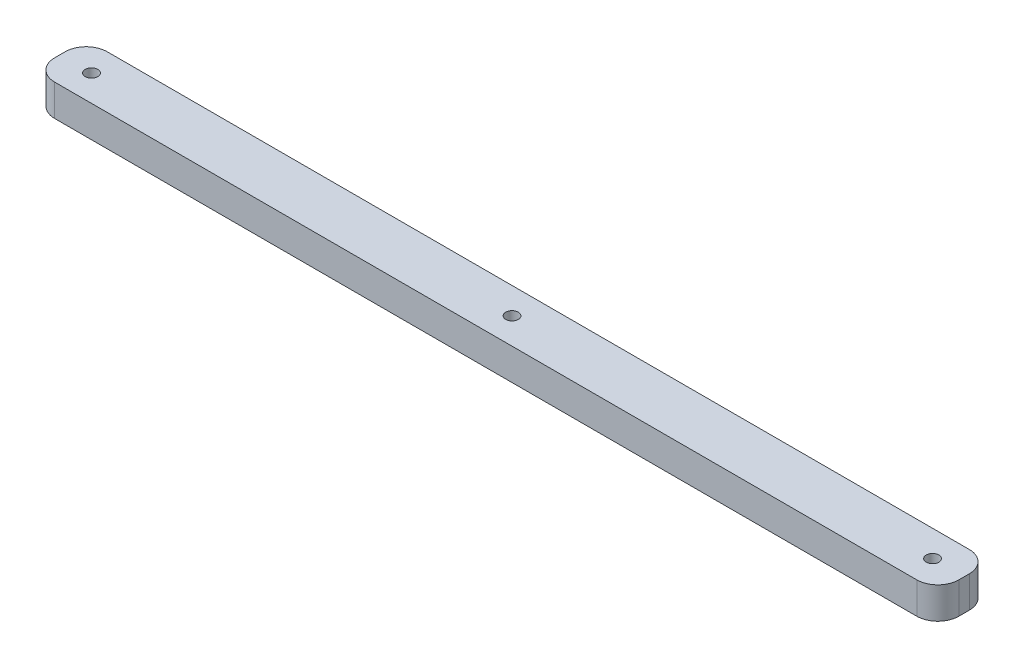
ISO-10303-21;
HEADER;
FILE_DESCRIPTION(('STEP AP214'),'2;1');
FILE_NAME('part.step','',(''),(''),'','','');
FILE_SCHEMA(('AUTOMOTIVE_DESIGN { 1 0 10303 214 1 1 1 1 }'));
ENDSEC;
DATA;
#1=APPLICATION_CONTEXT('core data for automotive mechanical design processes');
#2=APPLICATION_PROTOCOL_DEFINITION('international standard','automotive_design',2000,#1);
#3=PRODUCT_CONTEXT('',#1,'mechanical');
#4=PRODUCT('Part','Part','',(#3));
#5=PRODUCT_RELATED_PRODUCT_CATEGORY('part','',(#4));
#6=PRODUCT_DEFINITION_FORMATION('','',#4);
#7=PRODUCT_DEFINITION_CONTEXT('part definition',#1,'design');
#8=PRODUCT_DEFINITION('design','',#6,#7);
#9=PRODUCT_DEFINITION_SHAPE('','',#8);
#10=(LENGTH_UNIT() NAMED_UNIT(*) SI_UNIT(.MILLI.,.METRE.));
#11=(NAMED_UNIT(*) PLANE_ANGLE_UNIT() SI_UNIT($,.RADIAN.));
#12=(NAMED_UNIT(*) SI_UNIT($,.STERADIAN.) SOLID_ANGLE_UNIT());
#13=UNCERTAINTY_MEASURE_WITH_UNIT(LENGTH_MEASURE(1.E-05),#10,'distance_accuracy_value','');
#14=(GEOMETRIC_REPRESENTATION_CONTEXT(3) GLOBAL_UNCERTAINTY_ASSIGNED_CONTEXT((#13)) GLOBAL_UNIT_ASSIGNED_CONTEXT((#10,
#11,#12)) REPRESENTATION_CONTEXT('',''));
#15=CARTESIAN_POINT('',(0.,0.,0.));
#16=DIRECTION('',(0.,0.,1.));
#17=DIRECTION('',(1.,0.,0.));
#18=AXIS2_PLACEMENT_3D('',#15,#16,#17);
#19=CARTESIAN_POINT('',(0.,-3.,0.));
#20=DIRECTION('',(0.,-1.,0.));
#21=DIRECTION('',(0.,0.,-1.));
#22=AXIS2_PLACEMENT_3D('',#19,#20,#21);
#23=PLANE('',#22);
#24=CARTESIAN_POINT('',(-43.,-3.,-2.5));
#25=DIRECTION('',(0.,-1.,0.));
#26=DIRECTION('',(0.,0.,-1.));
#27=AXIS2_PLACEMENT_3D('',#24,#25,#26);
#28=CIRCLE('',#27,0.599999999999993);
#29=CARTESIAN_POINT('',(-43.,-3.,-3.1));
#30=VERTEX_POINT('',#29);
#31=EDGE_CURVE('E192',#30,#30,#28,.T.);
#32=ORIENTED_EDGE('',*,*,#31,.F.);
#33=EDGE_LOOP('',(#32));
#34=FACE_BOUND('',#33,.T.);
#35=CARTESIAN_POINT('',(-83.,-3.,-2.50000000000001));
#36=DIRECTION('',(0.,-1.,0.));
#37=DIRECTION('',(0.,0.,-1.));
#38=AXIS2_PLACEMENT_3D('',#35,#36,#37);
#39=CIRCLE('',#38,0.600000000000007);
#40=CARTESIAN_POINT('',(-83.,-3.,-3.10000000000002));
#41=VERTEX_POINT('',#40);
#42=EDGE_CURVE('E170',#41,#41,#39,.T.);
#43=ORIENTED_EDGE('',*,*,#42,.F.);
#44=EDGE_LOOP('',(#43));
#45=FACE_BOUND('',#44,.T.);
#46=DIRECTION('',(0.,0.,1.));
#47=VECTOR('',#46,1.);
#48=CARTESIAN_POINT('',(0.,-3.,-5.));
#49=LINE('',#48,#47);
#50=CARTESIAN_POINT('',(0.,-3.,-3.00000000000001));
#51=VERTEX_POINT('',#50);
#52=CARTESIAN_POINT('',(0.,-3.,-2.00000000000001));
#53=VERTEX_POINT('',#52);
#54=EDGE_CURVE('E177',#51,#53,#49,.T.);
#55=ORIENTED_EDGE('',*,*,#54,.T.);
#56=CARTESIAN_POINT('',(-2.00000000000001,-3.,-2.));
#57=DIRECTION('',(0.,-1.,0.));
#58=DIRECTION('',(0.,0.,-1.));
#59=AXIS2_PLACEMENT_3D('',#56,#57,#58);
#60=CIRCLE('',#59,2.);
#61=CARTESIAN_POINT('',(-2.00000000000001,-3.,0.));
#62=VERTEX_POINT('',#61);
#63=EDGE_CURVE('E154',#53,#62,#60,.T.);
#64=ORIENTED_EDGE('',*,*,#63,.T.);
#65=DIRECTION('',(-1.,0.,0.));
#66=VECTOR('',#65,1.);
#67=CARTESIAN_POINT('',(0.,-3.,0.));
#68=LINE('',#67,#66);
#69=CARTESIAN_POINT('',(-84.,-3.,0.));
#70=VERTEX_POINT('',#69);
#71=EDGE_CURVE('E125',#62,#70,#68,.T.);
#72=ORIENTED_EDGE('',*,*,#71,.T.);
#73=CARTESIAN_POINT('',(-84.,-3.,-2.));
#74=DIRECTION('',(0.,-1.,0.));
#75=DIRECTION('',(0.,0.,-1.));
#76=AXIS2_PLACEMENT_3D('',#73,#74,#75);
#77=CIRCLE('',#76,2.);
#78=CARTESIAN_POINT('',(-86.,-3.,-1.99999999999999));
#79=VERTEX_POINT('',#78);
#80=EDGE_CURVE('E149',#70,#79,#77,.T.);
#81=ORIENTED_EDGE('',*,*,#80,.T.);
#82=DIRECTION('',(0.,0.,-1.));
#83=VECTOR('',#82,1.);
#84=CARTESIAN_POINT('',(-86.,-3.,-5.));
#85=LINE('',#84,#83);
#86=CARTESIAN_POINT('',(-86.,-3.,-2.99999999999999));
#87=VERTEX_POINT('',#86);
#88=EDGE_CURVE('E132',#79,#87,#85,.T.);
#89=ORIENTED_EDGE('',*,*,#88,.T.);
#90=CARTESIAN_POINT('',(-84.,-3.,-3.));
#91=DIRECTION('',(0.,-1.,0.));
#92=DIRECTION('',(0.,0.,-1.));
#93=AXIS2_PLACEMENT_3D('',#90,#91,#92);
#94=CIRCLE('',#93,2.);
#95=CARTESIAN_POINT('',(-84.,-3.,-5.));
#96=VERTEX_POINT('',#95);
#97=EDGE_CURVE('E61',#87,#96,#94,.T.);
#98=ORIENTED_EDGE('',*,*,#97,.T.);
#99=DIRECTION('',(1.,0.,0.));
#100=VECTOR('',#99,1.);
#101=CARTESIAN_POINT('',(0.,-3.,-5.));
#102=LINE('',#101,#100);
#103=CARTESIAN_POINT('',(-2.00000000000001,-3.,-5.));
#104=VERTEX_POINT('',#103);
#105=EDGE_CURVE('E135',#96,#104,#102,.T.);
#106=ORIENTED_EDGE('',*,*,#105,.T.);
#107=CARTESIAN_POINT('',(-2.00000000000001,-3.,-3.));
#108=DIRECTION('',(0.,-1.,0.));
#109=DIRECTION('',(0.,0.,-1.));
#110=AXIS2_PLACEMENT_3D('',#107,#108,#109);
#111=CIRCLE('',#110,2.);
#112=EDGE_CURVE('E152',#104,#51,#111,.T.);
#113=ORIENTED_EDGE('',*,*,#112,.T.);
#114=EDGE_LOOP('',(#55,#64,#72,#81,#89,#98,#106,#113));
#115=FACE_BOUND('',#114,.T.);
#116=CARTESIAN_POINT('',(-3.,-3.,-2.49999999999999));
#117=DIRECTION('',(0.,-1.,0.));
#118=DIRECTION('',(0.,0.,-1.));
#119=AXIS2_PLACEMENT_3D('',#116,#117,#118);
#120=CIRCLE('',#119,0.6);
#121=CARTESIAN_POINT('',(-3.,-3.,-3.09999999999999));
#122=VERTEX_POINT('',#121);
#123=EDGE_CURVE('E182',#122,#122,#120,.T.);
#124=ORIENTED_EDGE('',*,*,#123,.F.);
#125=EDGE_LOOP('',(#124));
#126=FACE_BOUND('',#125,.T.);
#127=ADVANCED_FACE('F39',(#34,#45,#115,#126),#23,.T.);
#128=CARTESIAN_POINT('',(0.,0.,0.));
#129=DIRECTION('',(0.,-1.,0.));
#130=DIRECTION('',(0.,0.,-1.));
#131=AXIS2_PLACEMENT_3D('',#128,#129,#130);
#132=PLANE('',#131);
#133=CARTESIAN_POINT('',(-43.,0.,-2.5));
#134=DIRECTION('',(0.,-1.,0.));
#135=DIRECTION('',(0.,0.,-1.));
#136=AXIS2_PLACEMENT_3D('',#133,#134,#135);
#137=CIRCLE('',#136,0.599999999999993);
#138=CARTESIAN_POINT('',(-43.,0.,-3.1));
#139=VERTEX_POINT('',#138);
#140=EDGE_CURVE('E187',#139,#139,#137,.F.);
#141=ORIENTED_EDGE('',*,*,#140,.F.);
#142=EDGE_LOOP('',(#141));
#143=FACE_BOUND('',#142,.T.);
#144=DIRECTION('',(-1.,0.,0.));
#145=VECTOR('',#144,1.);
#146=CARTESIAN_POINT('',(0.,0.,0.));
#147=LINE('',#146,#145);
#148=CARTESIAN_POINT('',(-2.00000000000001,0.,0.));
#149=VERTEX_POINT('',#148);
#150=CARTESIAN_POINT('',(-84.,0.,0.));
#151=VERTEX_POINT('',#150);
#152=EDGE_CURVE('E122',#149,#151,#147,.T.);
#153=ORIENTED_EDGE('',*,*,#152,.F.);
#154=CARTESIAN_POINT('',(-2.00000000000001,0.,-2.));
#155=DIRECTION('',(0.,-1.,0.));
#156=DIRECTION('',(0.,0.,-1.));
#157=AXIS2_PLACEMENT_3D('',#154,#155,#156);
#158=CIRCLE('',#157,2.);
#159=CARTESIAN_POINT('',(0.,0.,-2.00000000000001));
#160=VERTEX_POINT('',#159);
#161=EDGE_CURVE('E105',#149,#160,#158,.F.);
#162=ORIENTED_EDGE('',*,*,#161,.T.);
#163=DIRECTION('',(0.,0.,1.));
#164=VECTOR('',#163,1.);
#165=CARTESIAN_POINT('',(0.,0.,-5.));
#166=LINE('',#165,#164);
#167=CARTESIAN_POINT('',(0.,0.,-3.00000000000001));
#168=VERTEX_POINT('',#167);
#169=EDGE_CURVE('E133',#168,#160,#166,.T.);
#170=ORIENTED_EDGE('',*,*,#169,.F.);
#171=CARTESIAN_POINT('',(-2.00000000000001,0.,-3.));
#172=DIRECTION('',(0.,-1.,0.));
#173=DIRECTION('',(0.,0.,-1.));
#174=AXIS2_PLACEMENT_3D('',#171,#172,#173);
#175=CIRCLE('',#174,2.);
#176=CARTESIAN_POINT('',(-2.00000000000001,0.,-5.));
#177=VERTEX_POINT('',#176);
#178=EDGE_CURVE('E116',#168,#177,#175,.F.);
#179=ORIENTED_EDGE('',*,*,#178,.T.);
#180=DIRECTION('',(1.,0.,0.));
#181=VECTOR('',#180,1.);
#182=CARTESIAN_POINT('',(0.,0.,-5.));
#183=LINE('',#182,#181);
#184=CARTESIAN_POINT('',(-84.,0.,-5.));
#185=VERTEX_POINT('',#184);
#186=EDGE_CURVE('E137',#185,#177,#183,.T.);
#187=ORIENTED_EDGE('',*,*,#186,.F.);
#188=CARTESIAN_POINT('',(-84.,0.,-3.));
#189=DIRECTION('',(0.,-1.,0.));
#190=DIRECTION('',(0.,0.,-1.));
#191=AXIS2_PLACEMENT_3D('',#188,#189,#190);
#192=CIRCLE('',#191,2.);
#193=CARTESIAN_POINT('',(-86.,0.,-2.99999999999999));
#194=VERTEX_POINT('',#193);
#195=EDGE_CURVE('E143',#185,#194,#192,.F.);
#196=ORIENTED_EDGE('',*,*,#195,.T.);
#197=DIRECTION('',(0.,0.,-1.));
#198=VECTOR('',#197,1.);
#199=CARTESIAN_POINT('',(-86.,0.,-5.));
#200=LINE('',#199,#198);
#201=CARTESIAN_POINT('',(-86.,0.,-1.99999999999999));
#202=VERTEX_POINT('',#201);
#203=EDGE_CURVE('E165',#202,#194,#200,.T.);
#204=ORIENTED_EDGE('',*,*,#203,.F.);
#205=CARTESIAN_POINT('',(-84.,0.,-2.));
#206=DIRECTION('',(0.,-1.,0.));
#207=DIRECTION('',(0.,0.,-1.));
#208=AXIS2_PLACEMENT_3D('',#205,#206,#207);
#209=CIRCLE('',#208,2.);
#210=EDGE_CURVE('E126',#202,#151,#209,.F.);
#211=ORIENTED_EDGE('',*,*,#210,.T.);
#212=EDGE_LOOP('',(#153,#162,#170,#179,#187,#196,#204,#211));
#213=FACE_BOUND('',#212,.T.);
#214=CARTESIAN_POINT('',(-83.,0.,-2.50000000000001));
#215=DIRECTION('',(0.,-1.,0.));
#216=DIRECTION('',(0.,0.,-1.));
#217=AXIS2_PLACEMENT_3D('',#214,#215,#216);
#218=CIRCLE('',#217,0.600000000000007);
#219=CARTESIAN_POINT('',(-83.,0.,-3.10000000000002));
#220=VERTEX_POINT('',#219);
#221=EDGE_CURVE('E173',#220,#220,#218,.T.);
#222=ORIENTED_EDGE('',*,*,#221,.T.);
#223=EDGE_LOOP('',(#222));
#224=FACE_BOUND('',#223,.T.);
#225=CARTESIAN_POINT('',(-3.,0.,-2.49999999999999));
#226=DIRECTION('',(0.,-1.,0.));
#227=DIRECTION('',(0.,0.,-1.));
#228=AXIS2_PLACEMENT_3D('',#225,#226,#227);
#229=CIRCLE('',#228,0.6);
#230=CARTESIAN_POINT('',(-3.,0.,-3.09999999999999));
#231=VERTEX_POINT('',#230);
#232=EDGE_CURVE('E184',#231,#231,#229,.T.);
#233=ORIENTED_EDGE('',*,*,#232,.T.);
#234=EDGE_LOOP('',(#233));
#235=FACE_BOUND('',#234,.T.);
#236=ADVANCED_FACE('F129',(#143,#213,#224,#235),#132,.F.);
#237=CARTESIAN_POINT('',(-86.,-3.,-5.));
#238=DIRECTION('',(1.,0.,0.));
#239=DIRECTION('',(0.,0.,-1.));
#240=AXIS2_PLACEMENT_3D('',#237,#238,#239);
#241=PLANE('',#240);
#242=ORIENTED_EDGE('',*,*,#203,.T.);
#243=DIRECTION('',(0.,1.,0.));
#244=VECTOR('',#243,1.);
#245=CARTESIAN_POINT('',(-86.,-3.,-2.99999999999999));
#246=LINE('',#245,#244);
#247=EDGE_CURVE('E11',#194,#87,#246,.F.);
#248=ORIENTED_EDGE('',*,*,#247,.T.);
#249=ORIENTED_EDGE('',*,*,#88,.F.);
#250=DIRECTION('',(0.,1.,0.));
#251=VECTOR('',#250,1.);
#252=CARTESIAN_POINT('',(-86.,-3.,-1.99999999999999));
#253=LINE('',#252,#251);
#254=EDGE_CURVE('E47',#79,#202,#253,.T.);
#255=ORIENTED_EDGE('',*,*,#254,.T.);
#256=EDGE_LOOP('',(#242,#248,#249,#255));
#257=FACE_BOUND('',#256,.T.);
#258=ADVANCED_FACE('F164',(#257),#241,.F.);
#259=CARTESIAN_POINT('',(0.,-3.,-5.));
#260=DIRECTION('',(0.,0.,1.));
#261=DIRECTION('',(1.,0.,0.));
#262=AXIS2_PLACEMENT_3D('',#259,#260,#261);
#263=PLANE('',#262);
#264=ORIENTED_EDGE('',*,*,#186,.T.);
#265=DIRECTION('',(0.,1.,0.));
#266=VECTOR('',#265,1.);
#267=CARTESIAN_POINT('',(-2.00000000000001,-3.,-5.));
#268=LINE('',#267,#266);
#269=EDGE_CURVE('E54',#177,#104,#268,.F.);
#270=ORIENTED_EDGE('',*,*,#269,.T.);
#271=ORIENTED_EDGE('',*,*,#105,.F.);
#272=DIRECTION('',(0.,1.,0.));
#273=VECTOR('',#272,1.);
#274=CARTESIAN_POINT('',(-84.,-3.,-5.));
#275=LINE('',#274,#273);
#276=EDGE_CURVE('E156',#96,#185,#275,.T.);
#277=ORIENTED_EDGE('',*,*,#276,.T.);
#278=EDGE_LOOP('',(#264,#270,#271,#277));
#279=FACE_BOUND('',#278,.T.);
#280=ADVANCED_FACE('F221',(#279),#263,.F.);
#281=CARTESIAN_POINT('',(0.,-3.,-5.));
#282=DIRECTION('',(-1.,0.,0.));
#283=DIRECTION('',(0.,0.,1.));
#284=AXIS2_PLACEMENT_3D('',#281,#282,#283);
#285=PLANE('',#284);
#286=ORIENTED_EDGE('',*,*,#169,.T.);
#287=DIRECTION('',(0.,1.,0.));
#288=VECTOR('',#287,1.);
#289=CARTESIAN_POINT('',(0.,-3.,-2.00000000000001));
#290=LINE('',#289,#288);
#291=EDGE_CURVE('E110',#160,#53,#290,.F.);
#292=ORIENTED_EDGE('',*,*,#291,.T.);
#293=ORIENTED_EDGE('',*,*,#54,.F.);
#294=DIRECTION('',(0.,1.,0.));
#295=VECTOR('',#294,1.);
#296=CARTESIAN_POINT('',(0.,-3.,-3.00000000000001));
#297=LINE('',#296,#295);
#298=EDGE_CURVE('E115',#51,#168,#297,.T.);
#299=ORIENTED_EDGE('',*,*,#298,.T.);
#300=EDGE_LOOP('',(#286,#292,#293,#299));
#301=FACE_BOUND('',#300,.T.);
#302=ADVANCED_FACE('F228',(#301),#285,.F.);
#303=CARTESIAN_POINT('',(0.,-3.,0.));
#304=DIRECTION('',(0.,0.,-1.));
#305=DIRECTION('',(-1.,0.,0.));
#306=AXIS2_PLACEMENT_3D('',#303,#304,#305);
#307=PLANE('',#306);
#308=ORIENTED_EDGE('',*,*,#71,.F.);
#309=DIRECTION('',(0.,1.,0.));
#310=VECTOR('',#309,1.);
#311=CARTESIAN_POINT('',(-2.00000000000001,-3.,0.));
#312=LINE('',#311,#310);
#313=EDGE_CURVE('E109',#62,#149,#312,.T.);
#314=ORIENTED_EDGE('',*,*,#313,.T.);
#315=ORIENTED_EDGE('',*,*,#152,.T.);
#316=DIRECTION('',(0.,1.,0.));
#317=VECTOR('',#316,1.);
#318=CARTESIAN_POINT('',(-84.,-3.,0.));
#319=LINE('',#318,#317);
#320=EDGE_CURVE('E127',#151,#70,#319,.F.);
#321=ORIENTED_EDGE('',*,*,#320,.T.);
#322=EDGE_LOOP('',(#308,#314,#315,#321));
#323=FACE_BOUND('',#322,.T.);
#324=ADVANCED_FACE('F121',(#323),#307,.F.);
#325=CARTESIAN_POINT('',(-83.,-3.,-2.50000000000001));
#326=DIRECTION('',(0.,1.,0.));
#327=DIRECTION('',(0.,0.,1.));
#328=AXIS2_PLACEMENT_3D('',#325,#326,#327);
#329=CYLINDRICAL_SURFACE('',#328,0.600000000000007);
#330=ORIENTED_EDGE('',*,*,#42,.T.);
#331=EDGE_LOOP('',(#330));
#332=FACE_BOUND('',#331,.T.);
#333=ORIENTED_EDGE('',*,*,#221,.F.);
#334=EDGE_LOOP('',(#333));
#335=FACE_BOUND('',#334,.T.);
#336=ADVANCED_FACE('F210',(#332,#335),#329,.F.);
#337=CARTESIAN_POINT('',(-3.,-3.,-2.49999999999999));
#338=DIRECTION('',(0.,1.,0.));
#339=DIRECTION('',(0.,0.,1.));
#340=AXIS2_PLACEMENT_3D('',#337,#338,#339);
#341=CYLINDRICAL_SURFACE('',#340,0.6);
#342=ORIENTED_EDGE('',*,*,#123,.T.);
#343=EDGE_LOOP('',(#342));
#344=FACE_BOUND('',#343,.T.);
#345=ORIENTED_EDGE('',*,*,#232,.F.);
#346=EDGE_LOOP('',(#345));
#347=FACE_BOUND('',#346,.T.);
#348=ADVANCED_FACE('F207',(#344,#347),#341,.F.);
#349=CARTESIAN_POINT('',(-2.00000000000001,-3.,-2.));
#350=DIRECTION('',(0.,1.,0.));
#351=DIRECTION('',(0.,0.,1.));
#352=AXIS2_PLACEMENT_3D('',#349,#350,#351);
#353=CYLINDRICAL_SURFACE('',#352,2.);
#354=ORIENTED_EDGE('',*,*,#63,.F.);
#355=ORIENTED_EDGE('',*,*,#291,.F.);
#356=ORIENTED_EDGE('',*,*,#161,.F.);
#357=ORIENTED_EDGE('',*,*,#313,.F.);
#358=EDGE_LOOP('',(#354,#355,#356,#357));
#359=FACE_BOUND('',#358,.T.);
#360=ADVANCED_FACE('F108',(#359),#353,.T.);
#361=CARTESIAN_POINT('',(-2.00000000000001,-3.,-3.));
#362=DIRECTION('',(0.,1.,0.));
#363=DIRECTION('',(0.,0.,1.));
#364=AXIS2_PLACEMENT_3D('',#361,#362,#363);
#365=CYLINDRICAL_SURFACE('',#364,2.);
#366=ORIENTED_EDGE('',*,*,#112,.F.);
#367=ORIENTED_EDGE('',*,*,#269,.F.);
#368=ORIENTED_EDGE('',*,*,#178,.F.);
#369=ORIENTED_EDGE('',*,*,#298,.F.);
#370=EDGE_LOOP('',(#366,#367,#368,#369));
#371=FACE_BOUND('',#370,.T.);
#372=ADVANCED_FACE('F236',(#371),#365,.T.);
#373=CARTESIAN_POINT('',(-84.,-3.,-3.));
#374=DIRECTION('',(0.,1.,0.));
#375=DIRECTION('',(0.,0.,1.));
#376=AXIS2_PLACEMENT_3D('',#373,#374,#375);
#377=CYLINDRICAL_SURFACE('',#376,2.);
#378=ORIENTED_EDGE('',*,*,#97,.F.);
#379=ORIENTED_EDGE('',*,*,#247,.F.);
#380=ORIENTED_EDGE('',*,*,#195,.F.);
#381=ORIENTED_EDGE('',*,*,#276,.F.);
#382=EDGE_LOOP('',(#378,#379,#380,#381));
#383=FACE_BOUND('',#382,.T.);
#384=ADVANCED_FACE('F238',(#383),#377,.T.);
#385=CARTESIAN_POINT('',(-84.,-3.,-2.));
#386=DIRECTION('',(0.,1.,0.));
#387=DIRECTION('',(0.,0.,1.));
#388=AXIS2_PLACEMENT_3D('',#385,#386,#387);
#389=CYLINDRICAL_SURFACE('',#388,2.);
#390=ORIENTED_EDGE('',*,*,#80,.F.);
#391=ORIENTED_EDGE('',*,*,#320,.F.);
#392=ORIENTED_EDGE('',*,*,#210,.F.);
#393=ORIENTED_EDGE('',*,*,#254,.F.);
#394=EDGE_LOOP('',(#390,#391,#392,#393));
#395=FACE_BOUND('',#394,.T.);
#396=ADVANCED_FACE('F41',(#395),#389,.T.);
#397=CARTESIAN_POINT('',(-43.,0.00100000000000013,-2.5));
#398=DIRECTION('',(0.,-1.,0.));
#399=DIRECTION('',(0.,0.,-1.));
#400=AXIS2_PLACEMENT_3D('',#397,#398,#399);
#401=CYLINDRICAL_SURFACE('',#400,0.599999999999993);
#402=ORIENTED_EDGE('',*,*,#31,.T.);
#403=EDGE_LOOP('',(#402));
#404=FACE_BOUND('',#403,.T.);
#405=ORIENTED_EDGE('',*,*,#140,.T.);
#406=EDGE_LOOP('',(#405));
#407=FACE_BOUND('',#406,.T.);
#408=ADVANCED_FACE('F196',(#404,#407),#401,.F.);
#409=CLOSED_SHELL('',(#127,#236,#258,#280,#302,#324,#336,#348,#360,#372,#384,#396,#408));
#410=MANIFOLD_SOLID_BREP('B2',#409);
#411=ADVANCED_BREP_SHAPE_REPRESENTATION('',(#18,#410),#14);
#412=SHAPE_DEFINITION_REPRESENTATION(#9,#411);
ENDSEC;
END-ISO-10303-21;
